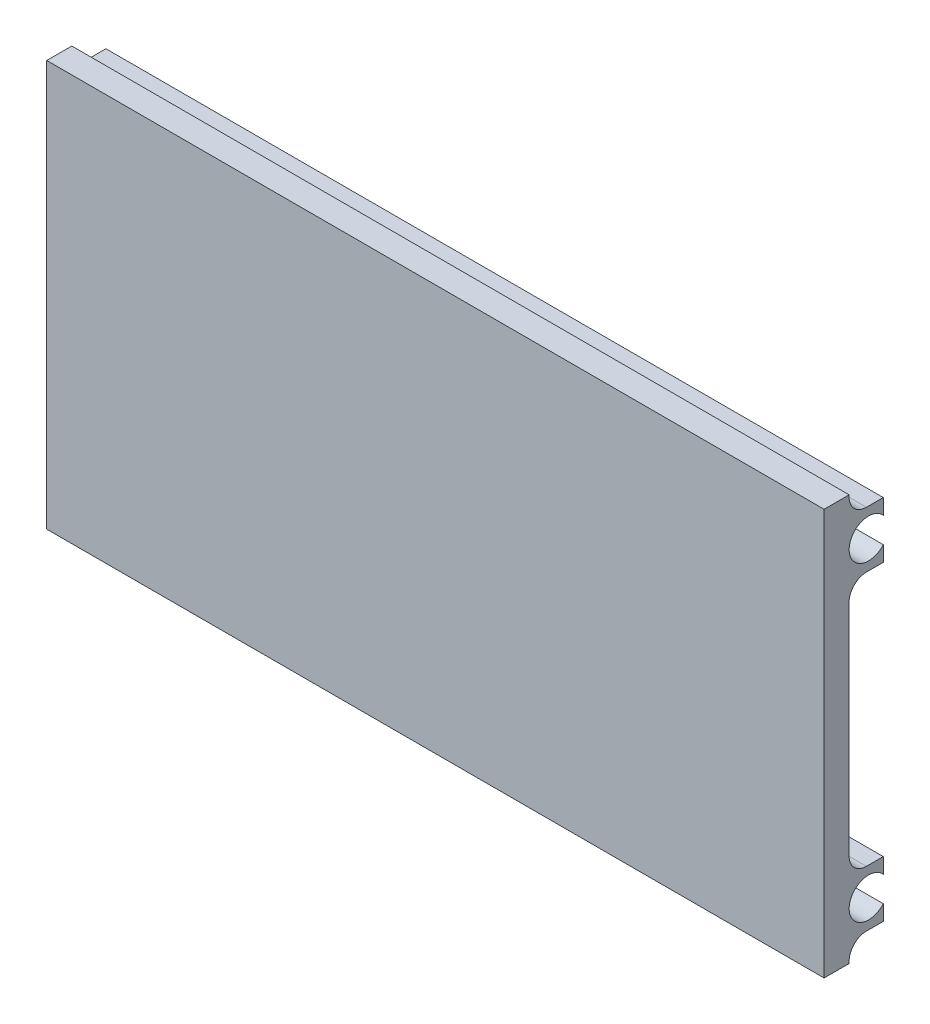
ISO-10303-21;
HEADER;
FILE_DESCRIPTION(('STEP AP214'),'2;1');
FILE_NAME('part.step','',(''),(''),'','','');
FILE_SCHEMA(('AUTOMOTIVE_DESIGN { 1 0 10303 214 1 1 1 1 }'));
ENDSEC;
DATA;
#1=APPLICATION_CONTEXT('core data for automotive mechanical design processes');
#2=APPLICATION_PROTOCOL_DEFINITION('international standard','automotive_design',2000,#1);
#3=PRODUCT_CONTEXT('',#1,'mechanical');
#4=PRODUCT('Part','Part','',(#3));
#5=PRODUCT_RELATED_PRODUCT_CATEGORY('part','',(#4));
#6=PRODUCT_DEFINITION_FORMATION('','',#4);
#7=PRODUCT_DEFINITION_CONTEXT('part definition',#1,'design');
#8=PRODUCT_DEFINITION('design','',#6,#7);
#9=PRODUCT_DEFINITION_SHAPE('','',#8);
#10=(LENGTH_UNIT() NAMED_UNIT(*) SI_UNIT(.MILLI.,.METRE.));
#11=(NAMED_UNIT(*) PLANE_ANGLE_UNIT() SI_UNIT($,.RADIAN.));
#12=(NAMED_UNIT(*) SI_UNIT($,.STERADIAN.) SOLID_ANGLE_UNIT());
#13=UNCERTAINTY_MEASURE_WITH_UNIT(LENGTH_MEASURE(1.E-05),#10,'distance_accuracy_value','');
#14=(GEOMETRIC_REPRESENTATION_CONTEXT(3) GLOBAL_UNCERTAINTY_ASSIGNED_CONTEXT((#13)) GLOBAL_UNIT_ASSIGNED_CONTEXT((#10,
#11,#12)) REPRESENTATION_CONTEXT('',''));
#15=CARTESIAN_POINT('',(0.,0.,0.));
#16=DIRECTION('',(0.,0.,1.));
#17=DIRECTION('',(1.,0.,0.));
#18=AXIS2_PLACEMENT_3D('',#15,#16,#17);
#19=CARTESIAN_POINT('',(0.,0.,-14.95));
#20=DIRECTION('',(0.,0.,1.));
#21=DIRECTION('',(0.,-1.,0.));
#22=AXIS2_PLACEMENT_3D('',#19,#20,#21);
#23=PLANE('',#22);
#24=DIRECTION('',(0.,-1.,0.));
#25=VECTOR('',#24,1.);
#26=CARTESIAN_POINT('',(90.,-23.5,-14.95));
#27=LINE('',#26,#25);
#28=CARTESIAN_POINT('',(90.,-14.75,-14.95));
#29=VERTEX_POINT('',#28);
#30=CARTESIAN_POINT('',(90.,-16.5260597027016,-14.95));
#31=VERTEX_POINT('',#30);
#32=EDGE_CURVE('E282',#29,#31,#27,.T.);
#33=ORIENTED_EDGE('',*,*,#32,.T.);
#34=DIRECTION('',(-1.,0.,0.));
#35=VECTOR('',#34,1.);
#36=CARTESIAN_POINT('',(0.,-16.5260597027016,-14.95));
#37=LINE('',#36,#35);
#38=CARTESIAN_POINT('',(0.,-16.5260597027016,-14.95));
#39=VERTEX_POINT('',#38);
#40=EDGE_CURVE('E205',#31,#39,#37,.T.);
#41=ORIENTED_EDGE('',*,*,#40,.T.);
#42=DIRECTION('',(0.,1.,0.));
#43=VECTOR('',#42,1.);
#44=CARTESIAN_POINT('',(0.,27.45,-14.95));
#45=LINE('',#44,#43);
#46=CARTESIAN_POINT('',(0.,-14.75,-14.95));
#47=VERTEX_POINT('',#46);
#48=EDGE_CURVE('E276',#39,#47,#45,.T.);
#49=ORIENTED_EDGE('',*,*,#48,.T.);
#50=DIRECTION('',(-1.,0.,0.));
#51=VECTOR('',#50,1.);
#52=CARTESIAN_POINT('',(90.,-14.75,-14.95));
#53=LINE('',#52,#51);
#54=EDGE_CURVE('E259',#29,#47,#53,.T.);
#55=ORIENTED_EDGE('',*,*,#54,.F.);
#56=EDGE_LOOP('',(#33,#41,#49,#55));
#57=FACE_BOUND('',#56,.T.);
#58=ADVANCED_FACE('F33',(#57),#23,.F.);
#59=CARTESIAN_POINT('',(0.,-25.7499999999933,-5.49999999999999));
#60=DIRECTION('',(1.,0.,0.));
#61=DIRECTION('',(0.,0.,-1.));
#62=AXIS2_PLACEMENT_3D('',#59,#60,#61);
#63=PLANE('',#62);
#64=DIRECTION('',(0.,0.,1.));
#65=VECTOR('',#64,1.);
#66=CARTESIAN_POINT('',(0.,-23.5,-14.95));
#67=LINE('',#66,#65);
#68=CARTESIAN_POINT('',(0.,-23.5,-11.));
#69=VERTEX_POINT('',#68);
#70=CARTESIAN_POINT('',(0.,-23.5,-8.1));
#71=VERTEX_POINT('',#70);
#72=EDGE_CURVE('E180',#69,#71,#67,.T.);
#73=ORIENTED_EDGE('',*,*,#72,.T.);
#74=DIRECTION('',(0.,-1.,0.));
#75=VECTOR('',#74,1.);
#76=CARTESIAN_POINT('',(0.,23.5,-8.1));
#77=LINE('',#76,#75);
#78=CARTESIAN_POINT('',(0.,23.5,-8.1));
#79=VERTEX_POINT('',#78);
#80=EDGE_CURVE('E195',#79,#71,#77,.T.);
#81=ORIENTED_EDGE('',*,*,#80,.F.);
#82=DIRECTION('',(0.,0.,1.));
#83=VECTOR('',#82,1.);
#84=CARTESIAN_POINT('',(0.,23.5,-11.));
#85=LINE('',#84,#83);
#86=CARTESIAN_POINT('',(0.,23.5,-11.));
#87=VERTEX_POINT('',#86);
#88=EDGE_CURVE('E231',#87,#79,#85,.T.);
#89=ORIENTED_EDGE('',*,*,#88,.F.);
#90=DIRECTION('',(0.,1.,0.));
#91=VECTOR('',#90,1.);
#92=CARTESIAN_POINT('',(0.,21.25,-11.));
#93=LINE('',#92,#91);
#94=CARTESIAN_POINT('',(0.,23.25,-11.));
#95=VERTEX_POINT('',#94);
#96=EDGE_CURVE('E242',#95,#87,#93,.T.);
#97=ORIENTED_EDGE('',*,*,#96,.F.);
#98=CARTESIAN_POINT('',(0.,23.25,-13.));
#99=DIRECTION('',(1.,0.,0.));
#100=DIRECTION('',(0.,0.,-1.));
#101=AXIS2_PLACEMENT_3D('',#98,#99,#100);
#102=CIRCLE('',#101,2.);
#103=CARTESIAN_POINT('',(0.,21.25,-13.));
#104=VERTEX_POINT('',#103);
#105=EDGE_CURVE('E41',#95,#104,#102,.T.);
#106=ORIENTED_EDGE('',*,*,#105,.T.);
#107=DIRECTION('',(0.,0.,1.));
#108=VECTOR('',#107,1.);
#109=CARTESIAN_POINT('',(0.,21.25,-14.95));
#110=LINE('',#109,#108);
#111=CARTESIAN_POINT('',(0.,21.25,-14.95));
#112=VERTEX_POINT('',#111);
#113=EDGE_CURVE('E238',#112,#104,#110,.T.);
#114=ORIENTED_EDGE('',*,*,#113,.F.);
#115=CARTESIAN_POINT('',(0.,19.4739402972984,-14.95));
#116=VERTEX_POINT('',#115);
#117=EDGE_CURVE('E269',#116,#112,#45,.T.);
#118=ORIENTED_EDGE('',*,*,#117,.F.);
#119=CARTESIAN_POINT('',(0.,18.,-13.25));
#120=DIRECTION('',(-1.,0.,0.));
#121=DIRECTION('',(0.,0.,1.));
#122=AXIS2_PLACEMENT_3D('',#119,#120,#121);
#123=CIRCLE('',#122,2.25);
#124=CARTESIAN_POINT('',(0.,16.5260597027016,-14.95));
#125=VERTEX_POINT('',#124);
#126=EDGE_CURVE('E208',#125,#116,#123,.T.);
#127=ORIENTED_EDGE('',*,*,#126,.F.);
#128=CARTESIAN_POINT('',(0.,14.75,-14.95));
#129=VERTEX_POINT('',#128);
#130=EDGE_CURVE('E277',#129,#125,#45,.T.);
#131=ORIENTED_EDGE('',*,*,#130,.F.);
#132=DIRECTION('',(0.,0.,-1.));
#133=VECTOR('',#132,1.);
#134=CARTESIAN_POINT('',(0.,14.75,-11.));
#135=LINE('',#134,#133);
#136=CARTESIAN_POINT('',(0.,14.75,-13.));
#137=VERTEX_POINT('',#136);
#138=EDGE_CURVE('E254',#137,#129,#135,.T.);
#139=ORIENTED_EDGE('',*,*,#138,.F.);
#140=CARTESIAN_POINT('',(0.,12.75,-13.));
#141=DIRECTION('',(1.,0.,0.));
#142=DIRECTION('',(0.,0.,-1.));
#143=AXIS2_PLACEMENT_3D('',#140,#141,#142);
#144=CIRCLE('',#143,2.);
#145=CARTESIAN_POINT('',(0.,12.75,-11.));
#146=VERTEX_POINT('',#145);
#147=EDGE_CURVE('E312',#137,#146,#144,.T.);
#148=ORIENTED_EDGE('',*,*,#147,.T.);
#149=DIRECTION('',(0.,1.,0.));
#150=VECTOR('',#149,1.);
#151=CARTESIAN_POINT('',(0.,-14.75,-11.));
#152=LINE('',#151,#150);
#153=CARTESIAN_POINT('',(0.,-12.75,-11.));
#154=VERTEX_POINT('',#153);
#155=EDGE_CURVE('E262',#154,#146,#152,.T.);
#156=ORIENTED_EDGE('',*,*,#155,.F.);
#157=CARTESIAN_POINT('',(0.,-12.75,-13.));
#158=DIRECTION('',(1.,0.,0.));
#159=DIRECTION('',(0.,0.,-1.));
#160=AXIS2_PLACEMENT_3D('',#157,#158,#159);
#161=CIRCLE('',#160,2.);
#162=CARTESIAN_POINT('',(0.,-14.75,-13.));
#163=VERTEX_POINT('',#162);
#164=EDGE_CURVE('E308',#154,#163,#161,.T.);
#165=ORIENTED_EDGE('',*,*,#164,.T.);
#166=DIRECTION('',(0.,0.,1.));
#167=VECTOR('',#166,1.);
#168=CARTESIAN_POINT('',(0.,-14.75,-14.95));
#169=LINE('',#168,#167);
#170=EDGE_CURVE('E249',#47,#163,#169,.T.);
#171=ORIENTED_EDGE('',*,*,#170,.F.);
#172=ORIENTED_EDGE('',*,*,#48,.F.);
#173=CARTESIAN_POINT('',(0.,-18.,-13.25));
#174=DIRECTION('',(-1.,0.,0.));
#175=DIRECTION('',(0.,0.,1.));
#176=AXIS2_PLACEMENT_3D('',#173,#174,#175);
#177=CIRCLE('',#176,2.25);
#178=CARTESIAN_POINT('',(0.,-19.4739402972984,-14.95));
#179=VERTEX_POINT('',#178);
#180=EDGE_CURVE('E200',#179,#39,#177,.T.);
#181=ORIENTED_EDGE('',*,*,#180,.F.);
#182=CARTESIAN_POINT('',(0.,-21.25,-14.95));
#183=VERTEX_POINT('',#182);
#184=EDGE_CURVE('E272',#183,#179,#45,.T.);
#185=ORIENTED_EDGE('',*,*,#184,.F.);
#186=DIRECTION('',(0.,0.,-1.));
#187=VECTOR('',#186,1.);
#188=CARTESIAN_POINT('',(0.,-21.25,-11.));
#189=LINE('',#188,#187);
#190=CARTESIAN_POINT('',(0.,-21.25,-13.));
#191=VERTEX_POINT('',#190);
#192=EDGE_CURVE('E223',#191,#183,#189,.T.);
#193=ORIENTED_EDGE('',*,*,#192,.F.);
#194=CARTESIAN_POINT('',(0.,-23.25,-13.));
#195=DIRECTION('',(1.,0.,0.));
#196=DIRECTION('',(0.,0.,-1.));
#197=AXIS2_PLACEMENT_3D('',#194,#195,#196);
#198=CIRCLE('',#197,2.);
#199=CARTESIAN_POINT('',(0.,-23.25,-11.));
#200=VERTEX_POINT('',#199);
#201=EDGE_CURVE('E304',#191,#200,#198,.T.);
#202=ORIENTED_EDGE('',*,*,#201,.T.);
#203=DIRECTION('',(0.,1.,0.));
#204=VECTOR('',#203,1.);
#205=CARTESIAN_POINT('',(0.,-23.5,-11.));
#206=LINE('',#205,#204);
#207=EDGE_CURVE('E219',#69,#200,#206,.T.);
#208=ORIENTED_EDGE('',*,*,#207,.F.);
#209=EDGE_LOOP('',(#73,#81,#89,#97,#106,#114,#118,#127,#131,#139,#148,#156,#165,#171,#172,#181,
#185,#193,#202,#208));
#210=FACE_BOUND('',#209,.T.);
#211=ADVANCED_FACE('F329',(#210),#63,.F.);
#212=CARTESIAN_POINT('',(90.,21.25,-14.95));
#213=VERTEX_POINT('',#212);
#214=CARTESIAN_POINT('',(90.,19.4739402972984,-14.95));
#215=VERTEX_POINT('',#214);
#216=EDGE_CURVE('E278',#213,#215,#27,.T.);
#217=ORIENTED_EDGE('',*,*,#216,.T.);
#218=DIRECTION('',(-1.,0.,0.));
#219=VECTOR('',#218,1.);
#220=CARTESIAN_POINT('',(0.,19.4739402972984,-14.95));
#221=LINE('',#220,#219);
#222=EDGE_CURVE('E216',#215,#116,#221,.T.);
#223=ORIENTED_EDGE('',*,*,#222,.T.);
#224=ORIENTED_EDGE('',*,*,#117,.T.);
#225=DIRECTION('',(-1.,0.,0.));
#226=VECTOR('',#225,1.);
#227=CARTESIAN_POINT('',(90.,21.25,-14.95));
#228=LINE('',#227,#226);
#229=EDGE_CURVE('E244',#213,#112,#228,.T.);
#230=ORIENTED_EDGE('',*,*,#229,.F.);
#231=EDGE_LOOP('',(#217,#223,#224,#230));
#232=FACE_BOUND('',#231,.T.);
#233=ADVANCED_FACE('F378',(#232),#23,.F.);
#234=CARTESIAN_POINT('',(90.,-25.7499999999933,-5.49999999999999));
#235=DIRECTION('',(1.,0.,0.));
#236=DIRECTION('',(0.,0.,-1.));
#237=AXIS2_PLACEMENT_3D('',#234,#235,#236);
#238=PLANE('',#237);
#239=DIRECTION('',(0.,0.,1.));
#240=VECTOR('',#239,1.);
#241=CARTESIAN_POINT('',(90.,23.5,-11.));
#242=LINE('',#241,#240);
#243=CARTESIAN_POINT('',(90.,23.5,-11.));
#244=VERTEX_POINT('',#243);
#245=CARTESIAN_POINT('',(90.,23.5,-8.1));
#246=VERTEX_POINT('',#245);
#247=EDGE_CURVE('E186',#244,#246,#242,.T.);
#248=ORIENTED_EDGE('',*,*,#247,.T.);
#249=DIRECTION('',(0.,1.,0.));
#250=VECTOR('',#249,1.);
#251=CARTESIAN_POINT('',(90.,-23.5,-8.1));
#252=LINE('',#251,#250);
#253=CARTESIAN_POINT('',(90.,-23.5,-8.1));
#254=VERTEX_POINT('',#253);
#255=EDGE_CURVE('E183',#254,#246,#252,.T.);
#256=ORIENTED_EDGE('',*,*,#255,.F.);
#257=DIRECTION('',(0.,0.,1.));
#258=VECTOR('',#257,1.);
#259=CARTESIAN_POINT('',(90.,-23.5,-14.95));
#260=LINE('',#259,#258);
#261=CARTESIAN_POINT('',(90.,-23.5,-11.));
#262=VERTEX_POINT('',#261);
#263=EDGE_CURVE('E170',#262,#254,#260,.T.);
#264=ORIENTED_EDGE('',*,*,#263,.F.);
#265=DIRECTION('',(0.,1.,0.));
#266=VECTOR('',#265,1.);
#267=CARTESIAN_POINT('',(90.,-23.5,-11.));
#268=LINE('',#267,#266);
#269=CARTESIAN_POINT('',(90.,-23.25,-11.));
#270=VERTEX_POINT('',#269);
#271=EDGE_CURVE('E220',#262,#270,#268,.T.);
#272=ORIENTED_EDGE('',*,*,#271,.T.);
#273=CARTESIAN_POINT('',(90.,-23.25,-13.));
#274=DIRECTION('',(1.,0.,0.));
#275=DIRECTION('',(0.,0.,-1.));
#276=AXIS2_PLACEMENT_3D('',#273,#274,#275);
#277=CIRCLE('',#276,2.);
#278=CARTESIAN_POINT('',(90.,-21.25,-13.));
#279=VERTEX_POINT('',#278);
#280=EDGE_CURVE('E306',#270,#279,#277,.F.);
#281=ORIENTED_EDGE('',*,*,#280,.T.);
#282=DIRECTION('',(0.,0.,-1.));
#283=VECTOR('',#282,1.);
#284=CARTESIAN_POINT('',(90.,-21.25,-11.));
#285=LINE('',#284,#283);
#286=CARTESIAN_POINT('',(90.,-21.25,-14.95));
#287=VERTEX_POINT('',#286);
#288=EDGE_CURVE('E222',#279,#287,#285,.T.);
#289=ORIENTED_EDGE('',*,*,#288,.T.);
#290=CARTESIAN_POINT('',(90.,-19.4739402972984,-14.95));
#291=VERTEX_POINT('',#290);
#292=EDGE_CURVE('E275',#291,#287,#27,.T.);
#293=ORIENTED_EDGE('',*,*,#292,.F.);
#294=CARTESIAN_POINT('',(90.,-18.,-13.25));
#295=DIRECTION('',(1.,0.,0.));
#296=DIRECTION('',(0.,0.,-1.));
#297=AXIS2_PLACEMENT_3D('',#294,#295,#296);
#298=CIRCLE('',#297,2.25);
#299=EDGE_CURVE('E213',#31,#291,#298,.T.);
#300=ORIENTED_EDGE('',*,*,#299,.F.);
#301=ORIENTED_EDGE('',*,*,#32,.F.);
#302=DIRECTION('',(0.,0.,1.));
#303=VECTOR('',#302,1.);
#304=CARTESIAN_POINT('',(90.,-14.75,-14.95));
#305=LINE('',#304,#303);
#306=CARTESIAN_POINT('',(90.,-14.75,-13.));
#307=VERTEX_POINT('',#306);
#308=EDGE_CURVE('E250',#29,#307,#305,.T.);
#309=ORIENTED_EDGE('',*,*,#308,.T.);
#310=CARTESIAN_POINT('',(90.,-12.75,-13.));
#311=DIRECTION('',(1.,0.,0.));
#312=DIRECTION('',(0.,0.,-1.));
#313=AXIS2_PLACEMENT_3D('',#310,#311,#312);
#314=CIRCLE('',#313,2.);
#315=CARTESIAN_POINT('',(90.,-12.75,-11.));
#316=VERTEX_POINT('',#315);
#317=EDGE_CURVE('E310',#307,#316,#314,.F.);
#318=ORIENTED_EDGE('',*,*,#317,.T.);
#319=DIRECTION('',(0.,1.,0.));
#320=VECTOR('',#319,1.);
#321=CARTESIAN_POINT('',(90.,-14.75,-11.));
#322=LINE('',#321,#320);
#323=CARTESIAN_POINT('',(90.,12.75,-11.));
#324=VERTEX_POINT('',#323);
#325=EDGE_CURVE('E253',#316,#324,#322,.T.);
#326=ORIENTED_EDGE('',*,*,#325,.T.);
#327=CARTESIAN_POINT('',(90.,12.75,-13.));
#328=DIRECTION('',(1.,0.,0.));
#329=DIRECTION('',(0.,0.,-1.));
#330=AXIS2_PLACEMENT_3D('',#327,#328,#329);
#331=CIRCLE('',#330,2.);
#332=CARTESIAN_POINT('',(90.,14.75,-13.));
#333=VERTEX_POINT('',#332);
#334=EDGE_CURVE('E314',#324,#333,#331,.F.);
#335=ORIENTED_EDGE('',*,*,#334,.T.);
#336=DIRECTION('',(0.,0.,-1.));
#337=VECTOR('',#336,1.);
#338=CARTESIAN_POINT('',(90.,14.75,-11.));
#339=LINE('',#338,#337);
#340=CARTESIAN_POINT('',(90.,14.75,-14.95));
#341=VERTEX_POINT('',#340);
#342=EDGE_CURVE('E257',#333,#341,#339,.T.);
#343=ORIENTED_EDGE('',*,*,#342,.T.);
#344=CARTESIAN_POINT('',(90.,16.5260597027016,-14.95));
#345=VERTEX_POINT('',#344);
#346=EDGE_CURVE('E281',#345,#341,#27,.T.);
#347=ORIENTED_EDGE('',*,*,#346,.F.);
#348=CARTESIAN_POINT('',(90.,18.,-13.25));
#349=DIRECTION('',(-1.,0.,0.));
#350=DIRECTION('',(0.,0.,1.));
#351=AXIS2_PLACEMENT_3D('',#348,#349,#350);
#352=CIRCLE('',#351,2.24999999999999);
#353=EDGE_CURVE('E179',#345,#215,#352,.T.);
#354=ORIENTED_EDGE('',*,*,#353,.T.);
#355=ORIENTED_EDGE('',*,*,#216,.F.);
#356=DIRECTION('',(0.,0.,1.));
#357=VECTOR('',#356,1.);
#358=CARTESIAN_POINT('',(90.,21.25,-14.95));
#359=LINE('',#358,#357);
#360=CARTESIAN_POINT('',(90.,21.25,-13.));
#361=VERTEX_POINT('',#360);
#362=EDGE_CURVE('E239',#213,#361,#359,.T.);
#363=ORIENTED_EDGE('',*,*,#362,.T.);
#364=CARTESIAN_POINT('',(90.,23.25,-13.));
#365=DIRECTION('',(1.,0.,0.));
#366=DIRECTION('',(0.,0.,-1.));
#367=AXIS2_PLACEMENT_3D('',#364,#365,#366);
#368=CIRCLE('',#367,2.);
#369=CARTESIAN_POINT('',(90.,23.25,-11.));
#370=VERTEX_POINT('',#369);
#371=EDGE_CURVE('E11',#361,#370,#368,.F.);
#372=ORIENTED_EDGE('',*,*,#371,.T.);
#373=DIRECTION('',(0.,1.,0.));
#374=VECTOR('',#373,1.);
#375=CARTESIAN_POINT('',(90.,21.25,-11.));
#376=LINE('',#375,#374);
#377=EDGE_CURVE('E241',#370,#244,#376,.T.);
#378=ORIENTED_EDGE('',*,*,#377,.T.);
#379=EDGE_LOOP('',(#248,#256,#264,#272,#281,#289,#293,#300,#301,#309,#318,#326,#335,#343,#347,
#354,#355,#363,#372,#378));
#380=FACE_BOUND('',#379,.T.);
#381=ADVANCED_FACE('F184',(#380),#238,.T.);
#382=ORIENTED_EDGE('',*,*,#130,.T.);
#383=DIRECTION('',(-1.,0.,0.));
#384=VECTOR('',#383,1.);
#385=CARTESIAN_POINT('',(0.,16.5260597027016,-14.95));
#386=LINE('',#385,#384);
#387=EDGE_CURVE('E210',#125,#345,#386,.F.);
#388=ORIENTED_EDGE('',*,*,#387,.T.);
#389=ORIENTED_EDGE('',*,*,#346,.T.);
#390=DIRECTION('',(-1.,0.,0.));
#391=VECTOR('',#390,1.);
#392=CARTESIAN_POINT('',(90.,14.75,-14.95));
#393=LINE('',#392,#391);
#394=EDGE_CURVE('E266',#341,#129,#393,.T.);
#395=ORIENTED_EDGE('',*,*,#394,.T.);
#396=EDGE_LOOP('',(#382,#388,#389,#395));
#397=FACE_BOUND('',#396,.T.);
#398=ADVANCED_FACE('F387',(#397),#23,.F.);
#399=CARTESIAN_POINT('',(0.,-23.5,-14.95));
#400=DIRECTION('',(0.,1.,0.));
#401=DIRECTION('',(0.,0.,1.));
#402=AXIS2_PLACEMENT_3D('',#399,#400,#401);
#403=PLANE('',#402);
#404=ORIENTED_EDGE('',*,*,#263,.T.);
#405=DIRECTION('',(1.,0.,0.));
#406=VECTOR('',#405,1.);
#407=CARTESIAN_POINT('',(0.,-23.5,-8.1));
#408=LINE('',#407,#406);
#409=EDGE_CURVE('E175',#71,#254,#408,.T.);
#410=ORIENTED_EDGE('',*,*,#409,.F.);
#411=ORIENTED_EDGE('',*,*,#72,.F.);
#412=DIRECTION('',(-1.,0.,0.));
#413=VECTOR('',#412,1.);
#414=CARTESIAN_POINT('',(90.,-23.5,-11.));
#415=LINE('',#414,#413);
#416=EDGE_CURVE('E176',#262,#69,#415,.T.);
#417=ORIENTED_EDGE('',*,*,#416,.F.);
#418=EDGE_LOOP('',(#404,#410,#411,#417));
#419=FACE_BOUND('',#418,.T.);
#420=ADVANCED_FACE('F172',(#419),#403,.F.);
#421=ORIENTED_EDGE('',*,*,#184,.T.);
#422=DIRECTION('',(-1.,0.,0.));
#423=VECTOR('',#422,1.);
#424=CARTESIAN_POINT('',(0.,-19.4739402972984,-14.95));
#425=LINE('',#424,#423);
#426=EDGE_CURVE('E202',#179,#291,#425,.F.);
#427=ORIENTED_EDGE('',*,*,#426,.T.);
#428=ORIENTED_EDGE('',*,*,#292,.T.);
#429=DIRECTION('',(-1.,0.,0.));
#430=VECTOR('',#429,1.);
#431=CARTESIAN_POINT('',(90.,-21.25,-14.95));
#432=LINE('',#431,#430);
#433=EDGE_CURVE('E228',#287,#183,#432,.T.);
#434=ORIENTED_EDGE('',*,*,#433,.T.);
#435=EDGE_LOOP('',(#421,#427,#428,#434));
#436=FACE_BOUND('',#435,.T.);
#437=ADVANCED_FACE('F351',(#436),#23,.F.);
#438=CARTESIAN_POINT('',(90.,14.75,-11.));
#439=DIRECTION('',(0.,1.,0.));
#440=DIRECTION('',(0.,0.,1.));
#441=AXIS2_PLACEMENT_3D('',#438,#439,#440);
#442=PLANE('',#441);
#443=ORIENTED_EDGE('',*,*,#342,.F.);
#444=DIRECTION('',(-1.,0.,0.));
#445=VECTOR('',#444,1.);
#446=CARTESIAN_POINT('',(0.,14.75,-13.));
#447=LINE('',#446,#445);
#448=EDGE_CURVE('E297',#333,#137,#447,.T.);
#449=ORIENTED_EDGE('',*,*,#448,.T.);
#450=ORIENTED_EDGE('',*,*,#138,.T.);
#451=ORIENTED_EDGE('',*,*,#394,.F.);
#452=EDGE_LOOP('',(#443,#449,#450,#451));
#453=FACE_BOUND('',#452,.T.);
#454=ADVANCED_FACE('F325',(#453),#442,.F.);
#455=CARTESIAN_POINT('',(90.,-14.75,-11.));
#456=DIRECTION('',(0.,0.,1.));
#457=DIRECTION('',(1.,0.,0.));
#458=AXIS2_PLACEMENT_3D('',#455,#456,#457);
#459=PLANE('',#458);
#460=ORIENTED_EDGE('',*,*,#325,.F.);
#461=DIRECTION('',(-1.,0.,0.));
#462=VECTOR('',#461,1.);
#463=CARTESIAN_POINT('',(0.,-12.75,-11.));
#464=LINE('',#463,#462);
#465=EDGE_CURVE('E292',#316,#154,#464,.T.);
#466=ORIENTED_EDGE('',*,*,#465,.T.);
#467=ORIENTED_EDGE('',*,*,#155,.T.);
#468=DIRECTION('',(-1.,0.,0.));
#469=VECTOR('',#468,1.);
#470=CARTESIAN_POINT('',(90.,12.75,-11.));
#471=LINE('',#470,#469);
#472=EDGE_CURVE('E290',#146,#324,#471,.F.);
#473=ORIENTED_EDGE('',*,*,#472,.T.);
#474=EDGE_LOOP('',(#460,#466,#467,#473));
#475=FACE_BOUND('',#474,.T.);
#476=ADVANCED_FACE('F332',(#475),#459,.F.);
#477=CARTESIAN_POINT('',(90.,-14.75,-14.95));
#478=DIRECTION('',(0.,-1.,0.));
#479=DIRECTION('',(0.,0.,-1.));
#480=AXIS2_PLACEMENT_3D('',#477,#478,#479);
#481=PLANE('',#480);
#482=ORIENTED_EDGE('',*,*,#170,.T.);
#483=DIRECTION('',(-1.,0.,0.));
#484=VECTOR('',#483,1.);
#485=CARTESIAN_POINT('',(90.,-14.75,-13.));
#486=LINE('',#485,#484);
#487=EDGE_CURVE('E295',#163,#307,#486,.F.);
#488=ORIENTED_EDGE('',*,*,#487,.T.);
#489=ORIENTED_EDGE('',*,*,#308,.F.);
#490=ORIENTED_EDGE('',*,*,#54,.T.);
#491=EDGE_LOOP('',(#482,#488,#489,#490));
#492=FACE_BOUND('',#491,.T.);
#493=ADVANCED_FACE('F341',(#492),#481,.F.);
#494=CARTESIAN_POINT('',(90.,21.25,-11.));
#495=DIRECTION('',(0.,0.,1.));
#496=DIRECTION('',(0.,-1.,0.));
#497=AXIS2_PLACEMENT_3D('',#494,#495,#496);
#498=PLANE('',#497);
#499=ORIENTED_EDGE('',*,*,#377,.F.);
#500=DIRECTION('',(-1.,0.,0.));
#501=VECTOR('',#500,1.);
#502=CARTESIAN_POINT('',(0.,23.25,-11.));
#503=LINE('',#502,#501);
#504=EDGE_CURVE('E300',#370,#95,#503,.T.);
#505=ORIENTED_EDGE('',*,*,#504,.T.);
#506=ORIENTED_EDGE('',*,*,#96,.T.);
#507=DIRECTION('',(-1.,0.,0.));
#508=VECTOR('',#507,1.);
#509=CARTESIAN_POINT('',(90.,23.5,-11.));
#510=LINE('',#509,#508);
#511=EDGE_CURVE('E234',#244,#87,#510,.T.);
#512=ORIENTED_EDGE('',*,*,#511,.F.);
#513=EDGE_LOOP('',(#499,#505,#506,#512));
#514=FACE_BOUND('',#513,.T.);
#515=ADVANCED_FACE('F411',(#514),#498,.F.);
#516=CARTESIAN_POINT('',(90.,21.25,-14.95));
#517=DIRECTION('',(0.,-1.,0.));
#518=DIRECTION('',(0.,0.,-1.));
#519=AXIS2_PLACEMENT_3D('',#516,#517,#518);
#520=PLANE('',#519);
#521=ORIENTED_EDGE('',*,*,#113,.T.);
#522=DIRECTION('',(-1.,0.,0.));
#523=VECTOR('',#522,1.);
#524=CARTESIAN_POINT('',(90.,21.25,-13.));
#525=LINE('',#524,#523);
#526=EDGE_CURVE('E48',#104,#361,#525,.F.);
#527=ORIENTED_EDGE('',*,*,#526,.T.);
#528=ORIENTED_EDGE('',*,*,#362,.F.);
#529=ORIENTED_EDGE('',*,*,#229,.T.);
#530=EDGE_LOOP('',(#521,#527,#528,#529));
#531=FACE_BOUND('',#530,.T.);
#532=ADVANCED_FACE('F405',(#531),#520,.F.);
#533=CARTESIAN_POINT('',(90.,23.5,-11.));
#534=DIRECTION('',(0.,-1.,0.));
#535=DIRECTION('',(0.,0.,-1.));
#536=AXIS2_PLACEMENT_3D('',#533,#534,#535);
#537=PLANE('',#536);
#538=ORIENTED_EDGE('',*,*,#88,.T.);
#539=DIRECTION('',(-1.,0.,0.));
#540=VECTOR('',#539,1.);
#541=CARTESIAN_POINT('',(90.,23.5,-8.1));
#542=LINE('',#541,#540);
#543=EDGE_CURVE('E190',#246,#79,#542,.T.);
#544=ORIENTED_EDGE('',*,*,#543,.F.);
#545=ORIENTED_EDGE('',*,*,#247,.F.);
#546=ORIENTED_EDGE('',*,*,#511,.T.);
#547=EDGE_LOOP('',(#538,#544,#545,#546));
#548=FACE_BOUND('',#547,.T.);
#549=ADVANCED_FACE('F415',(#548),#537,.F.);
#550=CARTESIAN_POINT('',(90.,-21.25,-11.));
#551=DIRECTION('',(0.,1.,0.));
#552=DIRECTION('',(0.,0.,1.));
#553=AXIS2_PLACEMENT_3D('',#550,#551,#552);
#554=PLANE('',#553);
#555=ORIENTED_EDGE('',*,*,#288,.F.);
#556=DIRECTION('',(-1.,0.,0.));
#557=VECTOR('',#556,1.);
#558=CARTESIAN_POINT('',(0.,-21.25,-13.));
#559=LINE('',#558,#557);
#560=EDGE_CURVE('E285',#279,#191,#559,.T.);
#561=ORIENTED_EDGE('',*,*,#560,.T.);
#562=ORIENTED_EDGE('',*,*,#192,.T.);
#563=ORIENTED_EDGE('',*,*,#433,.F.);
#564=EDGE_LOOP('',(#555,#561,#562,#563));
#565=FACE_BOUND('',#564,.T.);
#566=ADVANCED_FACE('F355',(#565),#554,.F.);
#567=CARTESIAN_POINT('',(90.,-23.5,-11.));
#568=DIRECTION('',(0.,0.,1.));
#569=DIRECTION('',(0.,-1.,0.));
#570=AXIS2_PLACEMENT_3D('',#567,#568,#569);
#571=PLANE('',#570);
#572=ORIENTED_EDGE('',*,*,#207,.T.);
#573=DIRECTION('',(-1.,0.,0.));
#574=VECTOR('',#573,1.);
#575=CARTESIAN_POINT('',(90.,-23.25,-11.));
#576=LINE('',#575,#574);
#577=EDGE_CURVE('E288',#200,#270,#576,.F.);
#578=ORIENTED_EDGE('',*,*,#577,.T.);
#579=ORIENTED_EDGE('',*,*,#271,.F.);
#580=ORIENTED_EDGE('',*,*,#416,.T.);
#581=EDGE_LOOP('',(#572,#578,#579,#580));
#582=FACE_BOUND('',#581,.T.);
#583=ADVANCED_FACE('F372',(#582),#571,.F.);
#584=CARTESIAN_POINT('',(0.,18.,-13.25));
#585=DIRECTION('',(-1.,0.,0.));
#586=DIRECTION('',(0.,0.,1.));
#587=AXIS2_PLACEMENT_3D('',#584,#585,#586);
#588=CYLINDRICAL_SURFACE('',#587,2.25);
#589=ORIENTED_EDGE('',*,*,#353,.F.);
#590=ORIENTED_EDGE('',*,*,#387,.F.);
#591=ORIENTED_EDGE('',*,*,#126,.T.);
#592=ORIENTED_EDGE('',*,*,#222,.F.);
#593=EDGE_LOOP('',(#589,#590,#591,#592));
#594=FACE_BOUND('',#593,.T.);
#595=ADVANCED_FACE('F364',(#594),#588,.F.);
#596=CARTESIAN_POINT('',(0.,-18.,-13.25));
#597=DIRECTION('',(-1.,0.,0.));
#598=DIRECTION('',(0.,0.,1.));
#599=AXIS2_PLACEMENT_3D('',#596,#597,#598);
#600=CYLINDRICAL_SURFACE('',#599,2.25);
#601=ORIENTED_EDGE('',*,*,#299,.T.);
#602=ORIENTED_EDGE('',*,*,#426,.F.);
#603=ORIENTED_EDGE('',*,*,#180,.T.);
#604=ORIENTED_EDGE('',*,*,#40,.F.);
#605=EDGE_LOOP('',(#601,#602,#603,#604));
#606=FACE_BOUND('',#605,.T.);
#607=ADVANCED_FACE('F361',(#606),#600,.F.);
#608=CARTESIAN_POINT('',(90.,-23.25,-13.));
#609=DIRECTION('',(1.,0.,0.));
#610=DIRECTION('',(0.,0.,-1.));
#611=AXIS2_PLACEMENT_3D('',#608,#609,#610);
#612=CYLINDRICAL_SURFACE('',#611,2.);
#613=ORIENTED_EDGE('',*,*,#280,.F.);
#614=ORIENTED_EDGE('',*,*,#577,.F.);
#615=ORIENTED_EDGE('',*,*,#201,.F.);
#616=ORIENTED_EDGE('',*,*,#560,.F.);
#617=EDGE_LOOP('',(#613,#614,#615,#616));
#618=FACE_BOUND('',#617,.T.);
#619=ADVANCED_FACE('F363',(#618),#612,.F.);
#620=CARTESIAN_POINT('',(90.,-12.75,-13.));
#621=DIRECTION('',(1.,0.,0.));
#622=DIRECTION('',(0.,0.,-1.));
#623=AXIS2_PLACEMENT_3D('',#620,#621,#622);
#624=CYLINDRICAL_SURFACE('',#623,2.);
#625=ORIENTED_EDGE('',*,*,#317,.F.);
#626=ORIENTED_EDGE('',*,*,#487,.F.);
#627=ORIENTED_EDGE('',*,*,#164,.F.);
#628=ORIENTED_EDGE('',*,*,#465,.F.);
#629=EDGE_LOOP('',(#625,#626,#627,#628));
#630=FACE_BOUND('',#629,.T.);
#631=ADVANCED_FACE('F336',(#630),#624,.F.);
#632=CARTESIAN_POINT('',(90.,12.75,-13.));
#633=DIRECTION('',(1.,0.,0.));
#634=DIRECTION('',(0.,0.,-1.));
#635=AXIS2_PLACEMENT_3D('',#632,#633,#634);
#636=CYLINDRICAL_SURFACE('',#635,2.);
#637=ORIENTED_EDGE('',*,*,#334,.F.);
#638=ORIENTED_EDGE('',*,*,#472,.F.);
#639=ORIENTED_EDGE('',*,*,#147,.F.);
#640=ORIENTED_EDGE('',*,*,#448,.F.);
#641=EDGE_LOOP('',(#637,#638,#639,#640));
#642=FACE_BOUND('',#641,.T.);
#643=ADVANCED_FACE('F327',(#642),#636,.F.);
#644=CARTESIAN_POINT('',(90.,23.25,-13.));
#645=DIRECTION('',(1.,0.,0.));
#646=DIRECTION('',(0.,0.,-1.));
#647=AXIS2_PLACEMENT_3D('',#644,#645,#646);
#648=CYLINDRICAL_SURFACE('',#647,2.);
#649=ORIENTED_EDGE('',*,*,#371,.F.);
#650=ORIENTED_EDGE('',*,*,#526,.F.);
#651=ORIENTED_EDGE('',*,*,#105,.F.);
#652=ORIENTED_EDGE('',*,*,#504,.F.);
#653=EDGE_LOOP('',(#649,#650,#651,#652));
#654=FACE_BOUND('',#653,.T.);
#655=ADVANCED_FACE('F35',(#654),#648,.F.);
#656=CARTESIAN_POINT('',(0.,0.,-8.1));
#657=DIRECTION('',(0.,0.,1.));
#658=DIRECTION('',(1.,0.,0.));
#659=AXIS2_PLACEMENT_3D('',#656,#657,#658);
#660=PLANE('',#659);
#661=ORIENTED_EDGE('',*,*,#409,.T.);
#662=ORIENTED_EDGE('',*,*,#255,.T.);
#663=ORIENTED_EDGE('',*,*,#543,.T.);
#664=ORIENTED_EDGE('',*,*,#80,.T.);
#665=EDGE_LOOP('',(#661,#662,#663,#664));
#666=FACE_BOUND('',#665,.T.);
#667=ADVANCED_FACE('F193',(#666),#660,.T.);
#668=CLOSED_SHELL('',(#58,#211,#233,#381,#398,#420,#437,#454,#476,#493,#515,#532,#549,#566,#583,
#595,#607,#619,#631,#643,#655,#667));
#669=MANIFOLD_SOLID_BREP('B2',#668);
#670=ADVANCED_BREP_SHAPE_REPRESENTATION('',(#18,#669),#14);
#671=SHAPE_DEFINITION_REPRESENTATION(#9,#670);
ENDSEC;
END-ISO-10303-21;
